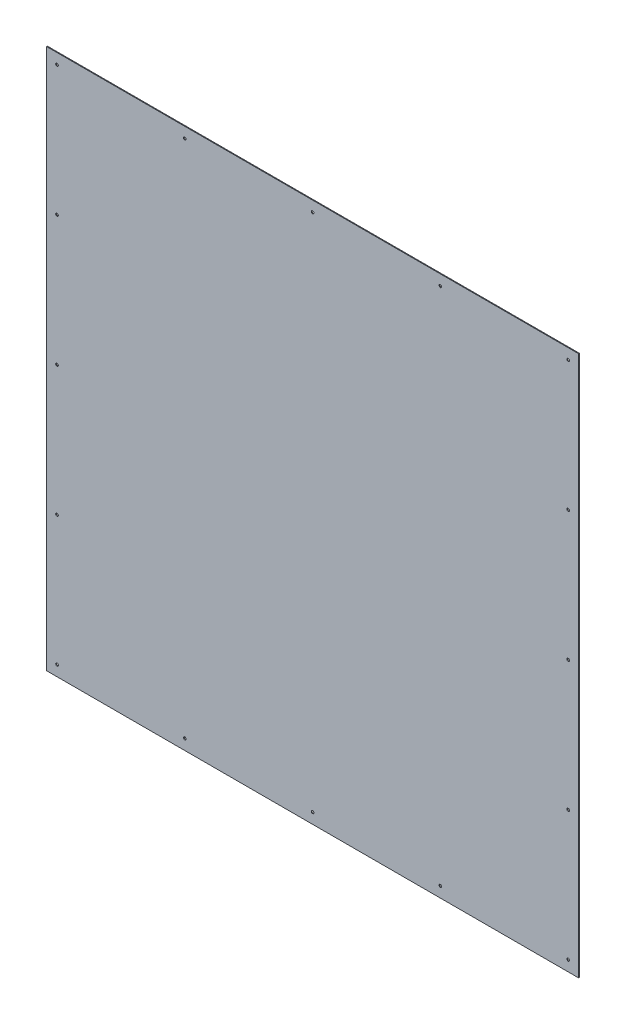
ISO-10303-21;
HEADER;
FILE_DESCRIPTION(('STEP AP214'),'2;1');
FILE_NAME('part.step','',(''),(''),'','','');
FILE_SCHEMA(('AUTOMOTIVE_DESIGN { 1 0 10303 214 1 1 1 1 }'));
ENDSEC;
DATA;
#1=APPLICATION_CONTEXT('core data for automotive mechanical design processes');
#2=APPLICATION_PROTOCOL_DEFINITION('international standard','automotive_design',2000,#1);
#3=PRODUCT_CONTEXT('',#1,'mechanical');
#4=PRODUCT('Part','Part','',(#3));
#5=PRODUCT_RELATED_PRODUCT_CATEGORY('part','',(#4));
#6=PRODUCT_DEFINITION_FORMATION('','',#4);
#7=PRODUCT_DEFINITION_CONTEXT('part definition',#1,'design');
#8=PRODUCT_DEFINITION('design','',#6,#7);
#9=PRODUCT_DEFINITION_SHAPE('','',#8);
#10=(LENGTH_UNIT() NAMED_UNIT(*) SI_UNIT(.MILLI.,.METRE.));
#11=(NAMED_UNIT(*) PLANE_ANGLE_UNIT() SI_UNIT($,.RADIAN.));
#12=(NAMED_UNIT(*) SI_UNIT($,.STERADIAN.) SOLID_ANGLE_UNIT());
#13=UNCERTAINTY_MEASURE_WITH_UNIT(LENGTH_MEASURE(1.E-05),#10,'distance_accuracy_value','');
#14=(GEOMETRIC_REPRESENTATION_CONTEXT(3) GLOBAL_UNCERTAINTY_ASSIGNED_CONTEXT((#13)) GLOBAL_UNIT_ASSIGNED_CONTEXT((#10,
#11,#12)) REPRESENTATION_CONTEXT('',''));
#15=CARTESIAN_POINT('',(0.,0.,0.));
#16=DIRECTION('',(0.,0.,1.));
#17=DIRECTION('',(1.,0.,0.));
#18=AXIS2_PLACEMENT_3D('',#15,#16,#17);
#19=CARTESIAN_POINT('',(640.,650.,1.9));
#20=DIRECTION('',(-1.,0.,0.));
#21=DIRECTION('',(0.,-1.,0.));
#22=AXIS2_PLACEMENT_3D('',#19,#20,#21);
#23=PLANE('',#22);
#24=DIRECTION('',(0.,1.,0.));
#25=VECTOR('',#24,1.);
#26=CARTESIAN_POINT('',(640.,650.,0.));
#27=LINE('',#26,#25);
#28=CARTESIAN_POINT('',(640.,-650.,0.));
#29=VERTEX_POINT('',#28);
#30=CARTESIAN_POINT('',(640.,650.,0.));
#31=VERTEX_POINT('',#30);
#32=EDGE_CURVE('E98',#29,#31,#27,.T.);
#33=ORIENTED_EDGE('',*,*,#32,.T.);
#34=DIRECTION('',(0.,0.,-1.));
#35=VECTOR('',#34,1.);
#36=CARTESIAN_POINT('',(640.,650.,1.9));
#37=LINE('',#36,#35);
#38=CARTESIAN_POINT('',(640.,650.,1.9));
#39=VERTEX_POINT('',#38);
#40=EDGE_CURVE('E11',#39,#31,#37,.T.);
#41=ORIENTED_EDGE('',*,*,#40,.F.);
#42=DIRECTION('',(0.,1.,0.));
#43=VECTOR('',#42,1.);
#44=CARTESIAN_POINT('',(640.,650.,1.9));
#45=LINE('',#44,#43);
#46=CARTESIAN_POINT('',(640.,-650.,1.9));
#47=VERTEX_POINT('',#46);
#48=EDGE_CURVE('E85',#47,#39,#45,.T.);
#49=ORIENTED_EDGE('',*,*,#48,.F.);
#50=DIRECTION('',(0.,0.,-1.));
#51=VECTOR('',#50,1.);
#52=CARTESIAN_POINT('',(640.,-650.,1.9));
#53=LINE('',#52,#51);
#54=EDGE_CURVE('E94',#47,#29,#53,.T.);
#55=ORIENTED_EDGE('',*,*,#54,.T.);
#56=EDGE_LOOP('',(#33,#41,#49,#55));
#57=FACE_BOUND('',#56,.T.);
#58=ADVANCED_FACE('F32',(#57),#23,.F.);
#59=CARTESIAN_POINT('',(-640.,650.,1.9));
#60=DIRECTION('',(0.,-1.,0.));
#61=DIRECTION('',(0.,0.,-1.));
#62=AXIS2_PLACEMENT_3D('',#59,#60,#61);
#63=PLANE('',#62);
#64=DIRECTION('',(-1.,0.,0.));
#65=VECTOR('',#64,1.);
#66=CARTESIAN_POINT('',(-640.,650.,0.));
#67=LINE('',#66,#65);
#68=CARTESIAN_POINT('',(-640.,650.,0.));
#69=VERTEX_POINT('',#68);
#70=EDGE_CURVE('E89',#31,#69,#67,.T.);
#71=ORIENTED_EDGE('',*,*,#70,.T.);
#72=DIRECTION('',(0.,0.,-1.));
#73=VECTOR('',#72,1.);
#74=CARTESIAN_POINT('',(-640.,650.,1.9));
#75=LINE('',#74,#73);
#76=CARTESIAN_POINT('',(-640.,650.,1.9));
#77=VERTEX_POINT('',#76);
#78=EDGE_CURVE('E41',#77,#69,#75,.T.);
#79=ORIENTED_EDGE('',*,*,#78,.F.);
#80=DIRECTION('',(-1.,0.,0.));
#81=VECTOR('',#80,1.);
#82=CARTESIAN_POINT('',(-640.,650.,1.9));
#83=LINE('',#82,#81);
#84=EDGE_CURVE('E80',#39,#77,#83,.T.);
#85=ORIENTED_EDGE('',*,*,#84,.F.);
#86=ORIENTED_EDGE('',*,*,#40,.T.);
#87=EDGE_LOOP('',(#71,#79,#85,#86));
#88=FACE_BOUND('',#87,.T.);
#89=ADVANCED_FACE('F88',(#88),#63,.F.);
#90=CARTESIAN_POINT('',(-640.,650.,1.9));
#91=DIRECTION('',(1.,0.,0.));
#92=DIRECTION('',(0.,1.,0.));
#93=AXIS2_PLACEMENT_3D('',#90,#91,#92);
#94=PLANE('',#93);
#95=DIRECTION('',(0.,-1.,0.));
#96=VECTOR('',#95,1.);
#97=CARTESIAN_POINT('',(-640.,650.,0.));
#98=LINE('',#97,#96);
#99=CARTESIAN_POINT('',(-640.,-650.,0.));
#100=VERTEX_POINT('',#99);
#101=EDGE_CURVE('E67',#69,#100,#98,.T.);
#102=ORIENTED_EDGE('',*,*,#101,.T.);
#103=DIRECTION('',(0.,0.,-1.));
#104=VECTOR('',#103,1.);
#105=CARTESIAN_POINT('',(-640.,-650.,1.9));
#106=LINE('',#105,#104);
#107=CARTESIAN_POINT('',(-640.,-650.,1.9));
#108=VERTEX_POINT('',#107);
#109=EDGE_CURVE('E90',#108,#100,#106,.T.);
#110=ORIENTED_EDGE('',*,*,#109,.F.);
#111=DIRECTION('',(0.,-1.,0.));
#112=VECTOR('',#111,1.);
#113=CARTESIAN_POINT('',(-640.,650.,1.9));
#114=LINE('',#113,#112);
#115=EDGE_CURVE('E83',#77,#108,#114,.T.);
#116=ORIENTED_EDGE('',*,*,#115,.F.);
#117=ORIENTED_EDGE('',*,*,#78,.T.);
#118=EDGE_LOOP('',(#102,#110,#116,#117));
#119=FACE_BOUND('',#118,.T.);
#120=ADVANCED_FACE('F92',(#119),#94,.F.);
#121=CARTESIAN_POINT('',(-640.,-650.,1.9));
#122=DIRECTION('',(0.,1.,0.));
#123=DIRECTION('',(0.,0.,1.));
#124=AXIS2_PLACEMENT_3D('',#121,#122,#123);
#125=PLANE('',#124);
#126=DIRECTION('',(1.,0.,0.));
#127=VECTOR('',#126,1.);
#128=CARTESIAN_POINT('',(-640.,-650.,0.));
#129=LINE('',#128,#127);
#130=EDGE_CURVE('E73',#100,#29,#129,.T.);
#131=ORIENTED_EDGE('',*,*,#130,.T.);
#132=ORIENTED_EDGE('',*,*,#54,.F.);
#133=DIRECTION('',(1.,0.,0.));
#134=VECTOR('',#133,1.);
#135=CARTESIAN_POINT('',(-640.,-650.,1.9));
#136=LINE('',#135,#134);
#137=EDGE_CURVE('E50',#108,#47,#136,.T.);
#138=ORIENTED_EDGE('',*,*,#137,.F.);
#139=ORIENTED_EDGE('',*,*,#109,.T.);
#140=EDGE_LOOP('',(#131,#132,#138,#139));
#141=FACE_BOUND('',#140,.T.);
#142=ADVANCED_FACE('F212',(#141),#125,.F.);
#143=CARTESIAN_POINT('',(0.,0.,1.9));
#144=DIRECTION('',(0.,0.,1.));
#145=DIRECTION('',(1.,0.,0.));
#146=AXIS2_PLACEMENT_3D('',#143,#144,#145);
#147=PLANE('',#146);
#148=CARTESIAN_POINT('',(-307.3,624.6,1.9));
#149=DIRECTION('',(0.,0.,1.));
#150=DIRECTION('',(1.,0.,0.));
#151=AXIS2_PLACEMENT_3D('',#148,#149,#150);
#152=CIRCLE('',#151,3.17499999999997);
#153=CARTESIAN_POINT('',(-304.125,624.6,1.9));
#154=VERTEX_POINT('',#153);
#155=EDGE_CURVE('E174',#154,#154,#152,.T.);
#156=ORIENTED_EDGE('',*,*,#155,.F.);
#157=EDGE_LOOP('',(#156));
#158=FACE_BOUND('',#157,.T.);
#159=CARTESIAN_POINT('',(-307.3,-624.6,1.9));
#160=DIRECTION('',(0.,0.,1.));
#161=DIRECTION('',(-1.,0.,0.));
#162=AXIS2_PLACEMENT_3D('',#159,#160,#161);
#163=CIRCLE('',#162,3.17499999999997);
#164=CARTESIAN_POINT('',(-310.475,-624.6,1.9));
#165=VERTEX_POINT('',#164);
#166=EDGE_CURVE('E189',#165,#165,#163,.T.);
#167=ORIENTED_EDGE('',*,*,#166,.F.);
#168=EDGE_LOOP('',(#167));
#169=FACE_BOUND('',#168,.T.);
#170=CARTESIAN_POINT('',(-614.6,-312.3,1.9));
#171=DIRECTION('',(0.,0.,1.));
#172=DIRECTION('',(1.,0.,0.));
#173=AXIS2_PLACEMENT_3D('',#170,#171,#172);
#174=CIRCLE('',#173,3.17500000000008);
#175=CARTESIAN_POINT('',(-611.425,-312.3,1.9));
#176=VERTEX_POINT('',#175);
#177=EDGE_CURVE('E185',#176,#176,#174,.T.);
#178=ORIENTED_EDGE('',*,*,#177,.F.);
#179=EDGE_LOOP('',(#178));
#180=FACE_BOUND('',#179,.T.);
#181=CARTESIAN_POINT('',(-614.6,0.,1.9));
#182=DIRECTION('',(0.,0.,1.));
#183=DIRECTION('',(1.,0.,0.));
#184=AXIS2_PLACEMENT_3D('',#181,#182,#183);
#185=CIRCLE('',#184,3.17500000000008);
#186=CARTESIAN_POINT('',(-611.425,0.,1.9));
#187=VERTEX_POINT('',#186);
#188=EDGE_CURVE('E182',#187,#187,#185,.T.);
#189=ORIENTED_EDGE('',*,*,#188,.F.);
#190=EDGE_LOOP('',(#189));
#191=FACE_BOUND('',#190,.T.);
#192=CARTESIAN_POINT('',(-614.6,312.3,1.9));
#193=DIRECTION('',(0.,0.,1.));
#194=DIRECTION('',(1.,0.,0.));
#195=AXIS2_PLACEMENT_3D('',#192,#193,#194);
#196=CIRCLE('',#195,3.17500000000008);
#197=CARTESIAN_POINT('',(-611.425,312.3,1.9));
#198=VERTEX_POINT('',#197);
#199=EDGE_CURVE('E186',#198,#198,#196,.T.);
#200=ORIENTED_EDGE('',*,*,#199,.F.);
#201=EDGE_LOOP('',(#200));
#202=FACE_BOUND('',#201,.T.);
#203=CARTESIAN_POINT('',(614.6,312.3,1.9));
#204=DIRECTION('',(0.,0.,1.));
#205=DIRECTION('',(-1.,0.,0.));
#206=AXIS2_PLACEMENT_3D('',#203,#204,#205);
#207=CIRCLE('',#206,3.17500000000008);
#208=CARTESIAN_POINT('',(611.425,312.3,1.9));
#209=VERTEX_POINT('',#208);
#210=EDGE_CURVE('E200',#209,#209,#207,.T.);
#211=ORIENTED_EDGE('',*,*,#210,.F.);
#212=EDGE_LOOP('',(#211));
#213=FACE_BOUND('',#212,.T.);
#214=CARTESIAN_POINT('',(614.6,0.,1.9));
#215=DIRECTION('',(0.,0.,1.));
#216=DIRECTION('',(-1.,0.,0.));
#217=AXIS2_PLACEMENT_3D('',#214,#215,#216);
#218=CIRCLE('',#217,3.17500000000008);
#219=CARTESIAN_POINT('',(611.425,0.,1.9));
#220=VERTEX_POINT('',#219);
#221=EDGE_CURVE('E197',#220,#220,#218,.T.);
#222=ORIENTED_EDGE('',*,*,#221,.F.);
#223=EDGE_LOOP('',(#222));
#224=FACE_BOUND('',#223,.T.);
#225=CARTESIAN_POINT('',(614.6,-312.3,1.9));
#226=DIRECTION('',(0.,0.,1.));
#227=DIRECTION('',(-1.,0.,0.));
#228=AXIS2_PLACEMENT_3D('',#225,#226,#227);
#229=CIRCLE('',#228,3.17500000000008);
#230=CARTESIAN_POINT('',(611.425,-312.3,1.9));
#231=VERTEX_POINT('',#230);
#232=EDGE_CURVE('E194',#231,#231,#229,.T.);
#233=ORIENTED_EDGE('',*,*,#232,.F.);
#234=EDGE_LOOP('',(#233));
#235=FACE_BOUND('',#234,.T.);
#236=CARTESIAN_POINT('',(-614.6,624.6,1.9));
#237=DIRECTION('',(0.,0.,1.));
#238=DIRECTION('',(-1.,0.,0.));
#239=AXIS2_PLACEMENT_3D('',#236,#237,#238);
#240=CIRCLE('',#239,3.17500000000011);
#241=CARTESIAN_POINT('',(-617.775,624.6,1.9));
#242=VERTEX_POINT('',#241);
#243=EDGE_CURVE('E114',#242,#242,#240,.T.);
#244=ORIENTED_EDGE('',*,*,#243,.F.);
#245=EDGE_LOOP('',(#244));
#246=FACE_BOUND('',#245,.T.);
#247=CARTESIAN_POINT('',(614.6,624.6,1.9));
#248=DIRECTION('',(0.,0.,1.));
#249=DIRECTION('',(1.,0.,0.));
#250=AXIS2_PLACEMENT_3D('',#247,#248,#249);
#251=CIRCLE('',#250,3.17500000000032);
#252=CARTESIAN_POINT('',(617.775,624.6,1.9));
#253=VERTEX_POINT('',#252);
#254=EDGE_CURVE('E164',#253,#253,#251,.T.);
#255=ORIENTED_EDGE('',*,*,#254,.F.);
#256=EDGE_LOOP('',(#255));
#257=FACE_BOUND('',#256,.T.);
#258=CARTESIAN_POINT('',(614.6,-624.6,1.9));
#259=DIRECTION('',(0.,0.,1.));
#260=DIRECTION('',(-1.,0.,0.));
#261=AXIS2_PLACEMENT_3D('',#258,#259,#260);
#262=CIRCLE('',#261,3.17500000000029);
#263=CARTESIAN_POINT('',(611.425,-624.6,1.9));
#264=VERTEX_POINT('',#263);
#265=EDGE_CURVE('E161',#264,#264,#262,.T.);
#266=ORIENTED_EDGE('',*,*,#265,.F.);
#267=EDGE_LOOP('',(#266));
#268=FACE_BOUND('',#267,.T.);
#269=CARTESIAN_POINT('',(-1.11022302462516E-13,624.6,1.9));
#270=DIRECTION('',(0.,0.,1.));
#271=DIRECTION('',(-1.,0.,0.));
#272=AXIS2_PLACEMENT_3D('',#269,#270,#271);
#273=CIRCLE('',#272,3.175);
#274=CARTESIAN_POINT('',(-3.17500000000011,624.6,1.9));
#275=VERTEX_POINT('',#274);
#276=EDGE_CURVE('E165',#275,#275,#273,.T.);
#277=ORIENTED_EDGE('',*,*,#276,.F.);
#278=EDGE_LOOP('',(#277));
#279=FACE_BOUND('',#278,.T.);
#280=CARTESIAN_POINT('',(-1.11022302462516E-13,-624.6,1.9));
#281=DIRECTION('',(0.,0.,1.));
#282=DIRECTION('',(1.,0.,0.));
#283=AXIS2_PLACEMENT_3D('',#280,#281,#282);
#284=CIRCLE('',#283,3.175);
#285=CARTESIAN_POINT('',(3.17499999999989,-624.6,1.9));
#286=VERTEX_POINT('',#285);
#287=EDGE_CURVE('E177',#286,#286,#284,.T.);
#288=ORIENTED_EDGE('',*,*,#287,.F.);
#289=EDGE_LOOP('',(#288));
#290=FACE_BOUND('',#289,.T.);
#291=CARTESIAN_POINT('',(307.3,-624.6,1.9));
#292=DIRECTION('',(0.,0.,1.));
#293=DIRECTION('',(1.,0.,0.));
#294=AXIS2_PLACEMENT_3D('',#291,#292,#293);
#295=CIRCLE('',#294,3.17499999999997);
#296=CARTESIAN_POINT('',(310.475,-624.6,1.9));
#297=VERTEX_POINT('',#296);
#298=EDGE_CURVE('E173',#297,#297,#295,.T.);
#299=ORIENTED_EDGE('',*,*,#298,.F.);
#300=EDGE_LOOP('',(#299));
#301=FACE_BOUND('',#300,.T.);
#302=CARTESIAN_POINT('',(307.3,624.6,1.9));
#303=DIRECTION('',(0.,0.,1.));
#304=DIRECTION('',(-1.,0.,0.));
#305=AXIS2_PLACEMENT_3D('',#302,#303,#304);
#306=CIRCLE('',#305,3.17499999999997);
#307=CARTESIAN_POINT('',(304.125,624.6,1.9));
#308=VERTEX_POINT('',#307);
#309=EDGE_CURVE('E170',#308,#308,#306,.T.);
#310=ORIENTED_EDGE('',*,*,#309,.F.);
#311=EDGE_LOOP('',(#310));
#312=FACE_BOUND('',#311,.T.);
#313=CARTESIAN_POINT('',(-614.6,-624.6,1.9));
#314=DIRECTION('',(0.,0.,1.));
#315=DIRECTION('',(1.,0.,0.));
#316=AXIS2_PLACEMENT_3D('',#313,#314,#315);
#317=CIRCLE('',#316,3.17500000000008);
#318=CARTESIAN_POINT('',(-611.425,-624.6,1.9));
#319=VERTEX_POINT('',#318);
#320=EDGE_CURVE('E109',#319,#319,#317,.T.);
#321=ORIENTED_EDGE('',*,*,#320,.F.);
#322=EDGE_LOOP('',(#321));
#323=FACE_BOUND('',#322,.T.);
#324=ORIENTED_EDGE('',*,*,#48,.T.);
#325=ORIENTED_EDGE('',*,*,#84,.T.);
#326=ORIENTED_EDGE('',*,*,#115,.T.);
#327=ORIENTED_EDGE('',*,*,#137,.T.);
#328=EDGE_LOOP('',(#324,#325,#326,#327));
#329=FACE_BOUND('',#328,.T.);
#330=ADVANCED_FACE('F81',(#158,#169,#180,#191,#202,#213,#224,#235,#246,#257,#268,#279,#290,#301,
#312,#323,#329),#147,.T.);
#331=CARTESIAN_POINT('',(0.,0.,0.));
#332=DIRECTION('',(0.,0.,1.));
#333=DIRECTION('',(1.,0.,0.));
#334=AXIS2_PLACEMENT_3D('',#331,#332,#333);
#335=PLANE('',#334);
#336=CARTESIAN_POINT('',(-307.3,624.6,0.));
#337=DIRECTION('',(0.,0.,1.));
#338=DIRECTION('',(1.,0.,0.));
#339=AXIS2_PLACEMENT_3D('',#336,#337,#338);
#340=CIRCLE('',#339,3.17499999999997);
#341=CARTESIAN_POINT('',(-304.125,624.6,0.));
#342=VERTEX_POINT('',#341);
#343=EDGE_CURVE('E35',#342,#342,#340,.T.);
#344=ORIENTED_EDGE('',*,*,#343,.T.);
#345=EDGE_LOOP('',(#344));
#346=FACE_BOUND('',#345,.T.);
#347=CARTESIAN_POINT('',(-307.3,-624.6,0.));
#348=DIRECTION('',(0.,0.,1.));
#349=DIRECTION('',(1.,0.,0.));
#350=AXIS2_PLACEMENT_3D('',#347,#348,#349);
#351=CIRCLE('',#350,3.17499999999997);
#352=CARTESIAN_POINT('',(-304.125,-624.6,0.));
#353=VERTEX_POINT('',#352);
#354=EDGE_CURVE('E149',#353,#353,#351,.T.);
#355=ORIENTED_EDGE('',*,*,#354,.T.);
#356=EDGE_LOOP('',(#355));
#357=FACE_BOUND('',#356,.T.);
#358=CARTESIAN_POINT('',(-614.6,-312.3,0.));
#359=DIRECTION('',(0.,0.,1.));
#360=DIRECTION('',(1.,0.,0.));
#361=AXIS2_PLACEMENT_3D('',#358,#359,#360);
#362=CIRCLE('',#361,3.17500000000008);
#363=CARTESIAN_POINT('',(-611.425,-312.3,0.));
#364=VERTEX_POINT('',#363);
#365=EDGE_CURVE('E147',#364,#364,#362,.T.);
#366=ORIENTED_EDGE('',*,*,#365,.T.);
#367=EDGE_LOOP('',(#366));
#368=FACE_BOUND('',#367,.T.);
#369=CARTESIAN_POINT('',(-614.6,0.,0.));
#370=DIRECTION('',(0.,0.,1.));
#371=DIRECTION('',(1.,0.,0.));
#372=AXIS2_PLACEMENT_3D('',#369,#370,#371);
#373=CIRCLE('',#372,3.17500000000008);
#374=CARTESIAN_POINT('',(-611.425,0.,0.));
#375=VERTEX_POINT('',#374);
#376=EDGE_CURVE('E144',#375,#375,#373,.T.);
#377=ORIENTED_EDGE('',*,*,#376,.T.);
#378=EDGE_LOOP('',(#377));
#379=FACE_BOUND('',#378,.T.);
#380=CARTESIAN_POINT('',(-614.6,312.3,0.));
#381=DIRECTION('',(0.,0.,1.));
#382=DIRECTION('',(1.,0.,0.));
#383=AXIS2_PLACEMENT_3D('',#380,#381,#382);
#384=CIRCLE('',#383,3.17500000000008);
#385=CARTESIAN_POINT('',(-611.425,312.3,0.));
#386=VERTEX_POINT('',#385);
#387=EDGE_CURVE('E141',#386,#386,#384,.T.);
#388=ORIENTED_EDGE('',*,*,#387,.T.);
#389=EDGE_LOOP('',(#388));
#390=FACE_BOUND('',#389,.T.);
#391=CARTESIAN_POINT('',(614.6,312.3,0.));
#392=DIRECTION('',(0.,0.,1.));
#393=DIRECTION('',(1.,0.,0.));
#394=AXIS2_PLACEMENT_3D('',#391,#392,#393);
#395=CIRCLE('',#394,3.17500000000008);
#396=CARTESIAN_POINT('',(617.775,312.3,0.));
#397=VERTEX_POINT('',#396);
#398=EDGE_CURVE('E138',#397,#397,#395,.T.);
#399=ORIENTED_EDGE('',*,*,#398,.T.);
#400=EDGE_LOOP('',(#399));
#401=FACE_BOUND('',#400,.T.);
#402=CARTESIAN_POINT('',(614.6,0.,0.));
#403=DIRECTION('',(0.,0.,1.));
#404=DIRECTION('',(1.,0.,0.));
#405=AXIS2_PLACEMENT_3D('',#402,#403,#404);
#406=CIRCLE('',#405,3.17500000000008);
#407=CARTESIAN_POINT('',(617.775,0.,0.));
#408=VERTEX_POINT('',#407);
#409=EDGE_CURVE('E135',#408,#408,#406,.T.);
#410=ORIENTED_EDGE('',*,*,#409,.T.);
#411=EDGE_LOOP('',(#410));
#412=FACE_BOUND('',#411,.T.);
#413=CARTESIAN_POINT('',(614.6,-312.3,0.));
#414=DIRECTION('',(0.,0.,1.));
#415=DIRECTION('',(1.,0.,0.));
#416=AXIS2_PLACEMENT_3D('',#413,#414,#415);
#417=CIRCLE('',#416,3.17500000000008);
#418=CARTESIAN_POINT('',(617.775,-312.3,0.));
#419=VERTEX_POINT('',#418);
#420=EDGE_CURVE('E132',#419,#419,#417,.T.);
#421=ORIENTED_EDGE('',*,*,#420,.T.);
#422=EDGE_LOOP('',(#421));
#423=FACE_BOUND('',#422,.T.);
#424=CARTESIAN_POINT('',(-614.6,624.6,0.));
#425=DIRECTION('',(0.,0.,1.));
#426=DIRECTION('',(1.,0.,0.));
#427=AXIS2_PLACEMENT_3D('',#424,#425,#426);
#428=CIRCLE('',#427,3.17500000000011);
#429=CARTESIAN_POINT('',(-611.425,624.6,0.));
#430=VERTEX_POINT('',#429);
#431=EDGE_CURVE('E129',#430,#430,#428,.T.);
#432=ORIENTED_EDGE('',*,*,#431,.T.);
#433=EDGE_LOOP('',(#432));
#434=FACE_BOUND('',#433,.T.);
#435=CARTESIAN_POINT('',(614.6,624.6,0.));
#436=DIRECTION('',(0.,0.,1.));
#437=DIRECTION('',(1.,0.,0.));
#438=AXIS2_PLACEMENT_3D('',#435,#436,#437);
#439=CIRCLE('',#438,3.17500000000032);
#440=CARTESIAN_POINT('',(617.775,624.6,0.));
#441=VERTEX_POINT('',#440);
#442=EDGE_CURVE('E126',#441,#441,#439,.T.);
#443=ORIENTED_EDGE('',*,*,#442,.T.);
#444=EDGE_LOOP('',(#443));
#445=FACE_BOUND('',#444,.T.);
#446=CARTESIAN_POINT('',(614.6,-624.6,0.));
#447=DIRECTION('',(0.,0.,1.));
#448=DIRECTION('',(1.,0.,0.));
#449=AXIS2_PLACEMENT_3D('',#446,#447,#448);
#450=CIRCLE('',#449,3.17500000000029);
#451=CARTESIAN_POINT('',(617.775,-624.6,0.));
#452=VERTEX_POINT('',#451);
#453=EDGE_CURVE('E123',#452,#452,#450,.T.);
#454=ORIENTED_EDGE('',*,*,#453,.T.);
#455=EDGE_LOOP('',(#454));
#456=FACE_BOUND('',#455,.T.);
#457=CARTESIAN_POINT('',(-1.11022302462516E-13,624.6,0.));
#458=DIRECTION('',(0.,0.,1.));
#459=DIRECTION('',(1.,0.,0.));
#460=AXIS2_PLACEMENT_3D('',#457,#458,#459);
#461=CIRCLE('',#460,3.175);
#462=CARTESIAN_POINT('',(3.17499999999989,624.6,0.));
#463=VERTEX_POINT('',#462);
#464=EDGE_CURVE('E120',#463,#463,#461,.T.);
#465=ORIENTED_EDGE('',*,*,#464,.T.);
#466=EDGE_LOOP('',(#465));
#467=FACE_BOUND('',#466,.T.);
#468=CARTESIAN_POINT('',(-1.11022302462516E-13,-624.6,0.));
#469=DIRECTION('',(0.,0.,1.));
#470=DIRECTION('',(1.,0.,0.));
#471=AXIS2_PLACEMENT_3D('',#468,#469,#470);
#472=CIRCLE('',#471,3.175);
#473=CARTESIAN_POINT('',(3.17499999999989,-624.6,0.));
#474=VERTEX_POINT('',#473);
#475=EDGE_CURVE('E117',#474,#474,#472,.T.);
#476=ORIENTED_EDGE('',*,*,#475,.T.);
#477=EDGE_LOOP('',(#476));
#478=FACE_BOUND('',#477,.T.);
#479=CARTESIAN_POINT('',(307.3,-624.6,0.));
#480=DIRECTION('',(0.,0.,1.));
#481=DIRECTION('',(1.,0.,0.));
#482=AXIS2_PLACEMENT_3D('',#479,#480,#481);
#483=CIRCLE('',#482,3.17499999999997);
#484=CARTESIAN_POINT('',(310.475,-624.6,0.));
#485=VERTEX_POINT('',#484);
#486=EDGE_CURVE('E113',#485,#485,#483,.T.);
#487=ORIENTED_EDGE('',*,*,#486,.T.);
#488=EDGE_LOOP('',(#487));
#489=FACE_BOUND('',#488,.T.);
#490=CARTESIAN_POINT('',(307.3,624.6,0.));
#491=DIRECTION('',(0.,0.,1.));
#492=DIRECTION('',(1.,0.,0.));
#493=AXIS2_PLACEMENT_3D('',#490,#491,#492);
#494=CIRCLE('',#493,3.17499999999997);
#495=CARTESIAN_POINT('',(310.475,624.6,0.));
#496=VERTEX_POINT('',#495);
#497=EDGE_CURVE('E110',#496,#496,#494,.T.);
#498=ORIENTED_EDGE('',*,*,#497,.T.);
#499=EDGE_LOOP('',(#498));
#500=FACE_BOUND('',#499,.T.);
#501=CARTESIAN_POINT('',(-614.6,-624.6,0.));
#502=DIRECTION('',(0.,0.,1.));
#503=DIRECTION('',(1.,0.,0.));
#504=AXIS2_PLACEMENT_3D('',#501,#502,#503);
#505=CIRCLE('',#504,3.17500000000008);
#506=CARTESIAN_POINT('',(-611.425,-624.6,0.));
#507=VERTEX_POINT('',#506);
#508=EDGE_CURVE('E101',#507,#507,#505,.T.);
#509=ORIENTED_EDGE('',*,*,#508,.T.);
#510=EDGE_LOOP('',(#509));
#511=FACE_BOUND('',#510,.T.);
#512=ORIENTED_EDGE('',*,*,#32,.F.);
#513=ORIENTED_EDGE('',*,*,#130,.F.);
#514=ORIENTED_EDGE('',*,*,#101,.F.);
#515=ORIENTED_EDGE('',*,*,#70,.F.);
#516=EDGE_LOOP('',(#512,#513,#514,#515));
#517=FACE_BOUND('',#516,.T.);
#518=ADVANCED_FACE('F211',(#346,#357,#368,#379,#390,#401,#412,#423,#434,#445,#456,#467,#478,
#489,#500,#511,#517),#335,.F.);
#519=CARTESIAN_POINT('',(-614.6,-624.6,-118.1));
#520=DIRECTION('',(0.,0.,1.));
#521=DIRECTION('',(1.,0.,0.));
#522=AXIS2_PLACEMENT_3D('',#519,#520,#521);
#523=CYLINDRICAL_SURFACE('',#522,3.17500000000008);
#524=ORIENTED_EDGE('',*,*,#320,.T.);
#525=EDGE_LOOP('',(#524));
#526=FACE_BOUND('',#525,.T.);
#527=ORIENTED_EDGE('',*,*,#508,.F.);
#528=EDGE_LOOP('',(#527));
#529=FACE_BOUND('',#528,.T.);
#530=ADVANCED_FACE('F240',(#526,#529),#523,.F.);
#531=CARTESIAN_POINT('',(307.3,624.6,-118.1));
#532=DIRECTION('',(0.,0.,1.));
#533=DIRECTION('',(1.,0.,0.));
#534=AXIS2_PLACEMENT_3D('',#531,#532,#533);
#535=CYLINDRICAL_SURFACE('',#534,3.17499999999997);
#536=ORIENTED_EDGE('',*,*,#309,.T.);
#537=EDGE_LOOP('',(#536));
#538=FACE_BOUND('',#537,.T.);
#539=ORIENTED_EDGE('',*,*,#497,.F.);
#540=EDGE_LOOP('',(#539));
#541=FACE_BOUND('',#540,.T.);
#542=ADVANCED_FACE('F236',(#538,#541),#535,.F.);
#543=CARTESIAN_POINT('',(307.3,-624.6,-118.1));
#544=DIRECTION('',(0.,0.,1.));
#545=DIRECTION('',(1.,0.,0.));
#546=AXIS2_PLACEMENT_3D('',#543,#544,#545);
#547=CYLINDRICAL_SURFACE('',#546,3.17499999999997);
#548=ORIENTED_EDGE('',*,*,#298,.T.);
#549=EDGE_LOOP('',(#548));
#550=FACE_BOUND('',#549,.T.);
#551=ORIENTED_EDGE('',*,*,#486,.F.);
#552=EDGE_LOOP('',(#551));
#553=FACE_BOUND('',#552,.T.);
#554=ADVANCED_FACE('F239',(#550,#553),#547,.F.);
#555=CARTESIAN_POINT('',(-1.11022302462516E-13,-624.6,-118.1));
#556=DIRECTION('',(0.,0.,1.));
#557=DIRECTION('',(1.,0.,0.));
#558=AXIS2_PLACEMENT_3D('',#555,#556,#557);
#559=CYLINDRICAL_SURFACE('',#558,3.175);
#560=ORIENTED_EDGE('',*,*,#287,.T.);
#561=EDGE_LOOP('',(#560));
#562=FACE_BOUND('',#561,.T.);
#563=ORIENTED_EDGE('',*,*,#475,.F.);
#564=EDGE_LOOP('',(#563));
#565=FACE_BOUND('',#564,.T.);
#566=ADVANCED_FACE('F306',(#562,#565),#559,.F.);
#567=CARTESIAN_POINT('',(-1.11022302462516E-13,624.6,-118.1));
#568=DIRECTION('',(0.,0.,1.));
#569=DIRECTION('',(1.,0.,0.));
#570=AXIS2_PLACEMENT_3D('',#567,#568,#569);
#571=CYLINDRICAL_SURFACE('',#570,3.175);
#572=ORIENTED_EDGE('',*,*,#276,.T.);
#573=EDGE_LOOP('',(#572));
#574=FACE_BOUND('',#573,.T.);
#575=ORIENTED_EDGE('',*,*,#464,.F.);
#576=EDGE_LOOP('',(#575));
#577=FACE_BOUND('',#576,.T.);
#578=ADVANCED_FACE('F316',(#574,#577),#571,.F.);
#579=CARTESIAN_POINT('',(614.6,-624.6,-118.1));
#580=DIRECTION('',(0.,0.,1.));
#581=DIRECTION('',(1.,0.,0.));
#582=AXIS2_PLACEMENT_3D('',#579,#580,#581);
#583=CYLINDRICAL_SURFACE('',#582,3.17500000000029);
#584=ORIENTED_EDGE('',*,*,#265,.T.);
#585=EDGE_LOOP('',(#584));
#586=FACE_BOUND('',#585,.T.);
#587=ORIENTED_EDGE('',*,*,#453,.F.);
#588=EDGE_LOOP('',(#587));
#589=FACE_BOUND('',#588,.T.);
#590=ADVANCED_FACE('F326',(#586,#589),#583,.F.);
#591=CARTESIAN_POINT('',(614.6,624.6,-118.1));
#592=DIRECTION('',(0.,0.,1.));
#593=DIRECTION('',(1.,0.,0.));
#594=AXIS2_PLACEMENT_3D('',#591,#592,#593);
#595=CYLINDRICAL_SURFACE('',#594,3.17500000000032);
#596=ORIENTED_EDGE('',*,*,#254,.T.);
#597=EDGE_LOOP('',(#596));
#598=FACE_BOUND('',#597,.T.);
#599=ORIENTED_EDGE('',*,*,#442,.F.);
#600=EDGE_LOOP('',(#599));
#601=FACE_BOUND('',#600,.T.);
#602=ADVANCED_FACE('F336',(#598,#601),#595,.F.);
#603=CARTESIAN_POINT('',(-614.6,624.6,-118.1));
#604=DIRECTION('',(0.,0.,1.));
#605=DIRECTION('',(1.,0.,0.));
#606=AXIS2_PLACEMENT_3D('',#603,#604,#605);
#607=CYLINDRICAL_SURFACE('',#606,3.17500000000011);
#608=ORIENTED_EDGE('',*,*,#243,.T.);
#609=EDGE_LOOP('',(#608));
#610=FACE_BOUND('',#609,.T.);
#611=ORIENTED_EDGE('',*,*,#431,.F.);
#612=EDGE_LOOP('',(#611));
#613=FACE_BOUND('',#612,.T.);
#614=ADVANCED_FACE('F346',(#610,#613),#607,.F.);
#615=CARTESIAN_POINT('',(614.6,-312.3,-118.1));
#616=DIRECTION('',(0.,0.,1.));
#617=DIRECTION('',(1.,0.,0.));
#618=AXIS2_PLACEMENT_3D('',#615,#616,#617);
#619=CYLINDRICAL_SURFACE('',#618,3.17500000000008);
#620=ORIENTED_EDGE('',*,*,#232,.T.);
#621=EDGE_LOOP('',(#620));
#622=FACE_BOUND('',#621,.T.);
#623=ORIENTED_EDGE('',*,*,#420,.F.);
#624=EDGE_LOOP('',(#623));
#625=FACE_BOUND('',#624,.T.);
#626=ADVANCED_FACE('F356',(#622,#625),#619,.F.);
#627=CARTESIAN_POINT('',(614.6,0.,-118.1));
#628=DIRECTION('',(0.,0.,1.));
#629=DIRECTION('',(1.,0.,0.));
#630=AXIS2_PLACEMENT_3D('',#627,#628,#629);
#631=CYLINDRICAL_SURFACE('',#630,3.17500000000008);
#632=ORIENTED_EDGE('',*,*,#221,.T.);
#633=EDGE_LOOP('',(#632));
#634=FACE_BOUND('',#633,.T.);
#635=ORIENTED_EDGE('',*,*,#409,.F.);
#636=EDGE_LOOP('',(#635));
#637=FACE_BOUND('',#636,.T.);
#638=ADVANCED_FACE('F366',(#634,#637),#631,.F.);
#639=CARTESIAN_POINT('',(614.6,312.3,-118.1));
#640=DIRECTION('',(0.,0.,1.));
#641=DIRECTION('',(1.,0.,0.));
#642=AXIS2_PLACEMENT_3D('',#639,#640,#641);
#643=CYLINDRICAL_SURFACE('',#642,3.17500000000008);
#644=ORIENTED_EDGE('',*,*,#210,.T.);
#645=EDGE_LOOP('',(#644));
#646=FACE_BOUND('',#645,.T.);
#647=ORIENTED_EDGE('',*,*,#398,.F.);
#648=EDGE_LOOP('',(#647));
#649=FACE_BOUND('',#648,.T.);
#650=ADVANCED_FACE('F376',(#646,#649),#643,.F.);
#651=CARTESIAN_POINT('',(-614.6,312.3,-118.1));
#652=DIRECTION('',(0.,0.,1.));
#653=DIRECTION('',(1.,0.,0.));
#654=AXIS2_PLACEMENT_3D('',#651,#652,#653);
#655=CYLINDRICAL_SURFACE('',#654,3.17500000000008);
#656=ORIENTED_EDGE('',*,*,#199,.T.);
#657=EDGE_LOOP('',(#656));
#658=FACE_BOUND('',#657,.T.);
#659=ORIENTED_EDGE('',*,*,#387,.F.);
#660=EDGE_LOOP('',(#659));
#661=FACE_BOUND('',#660,.T.);
#662=ADVANCED_FACE('F206',(#658,#661),#655,.F.);
#663=CARTESIAN_POINT('',(-614.6,0.,-118.1));
#664=DIRECTION('',(0.,0.,1.));
#665=DIRECTION('',(1.,0.,0.));
#666=AXIS2_PLACEMENT_3D('',#663,#664,#665);
#667=CYLINDRICAL_SURFACE('',#666,3.17500000000008);
#668=ORIENTED_EDGE('',*,*,#188,.T.);
#669=EDGE_LOOP('',(#668));
#670=FACE_BOUND('',#669,.T.);
#671=ORIENTED_EDGE('',*,*,#376,.F.);
#672=EDGE_LOOP('',(#671));
#673=FACE_BOUND('',#672,.T.);
#674=ADVANCED_FACE('F395',(#670,#673),#667,.F.);
#675=CARTESIAN_POINT('',(-614.6,-312.3,-118.1));
#676=DIRECTION('',(0.,0.,1.));
#677=DIRECTION('',(1.,0.,0.));
#678=AXIS2_PLACEMENT_3D('',#675,#676,#677);
#679=CYLINDRICAL_SURFACE('',#678,3.17500000000008);
#680=ORIENTED_EDGE('',*,*,#177,.T.);
#681=EDGE_LOOP('',(#680));
#682=FACE_BOUND('',#681,.T.);
#683=ORIENTED_EDGE('',*,*,#365,.F.);
#684=EDGE_LOOP('',(#683));
#685=FACE_BOUND('',#684,.T.);
#686=ADVANCED_FACE('F404',(#682,#685),#679,.F.);
#687=CARTESIAN_POINT('',(-307.3,-624.6,-118.1));
#688=DIRECTION('',(0.,0.,1.));
#689=DIRECTION('',(1.,0.,0.));
#690=AXIS2_PLACEMENT_3D('',#687,#688,#689);
#691=CYLINDRICAL_SURFACE('',#690,3.17499999999997);
#692=ORIENTED_EDGE('',*,*,#166,.T.);
#693=EDGE_LOOP('',(#692));
#694=FACE_BOUND('',#693,.T.);
#695=ORIENTED_EDGE('',*,*,#354,.F.);
#696=EDGE_LOOP('',(#695));
#697=FACE_BOUND('',#696,.T.);
#698=ADVANCED_FACE('F414',(#694,#697),#691,.F.);
#699=CARTESIAN_POINT('',(-307.3,624.6,-118.1));
#700=DIRECTION('',(0.,0.,1.));
#701=DIRECTION('',(1.,0.,0.));
#702=AXIS2_PLACEMENT_3D('',#699,#700,#701);
#703=CYLINDRICAL_SURFACE('',#702,3.17499999999997);
#704=ORIENTED_EDGE('',*,*,#155,.T.);
#705=EDGE_LOOP('',(#704));
#706=FACE_BOUND('',#705,.T.);
#707=ORIENTED_EDGE('',*,*,#343,.F.);
#708=EDGE_LOOP('',(#707));
#709=FACE_BOUND('',#708,.T.);
#710=ADVANCED_FACE('F424',(#706,#709),#703,.F.);
#711=CLOSED_SHELL('',(#58,#89,#120,#142,#330,#518,#530,#542,#554,#566,#578,#590,#602,#614,#626,
#638,#650,#662,#674,#686,#698,#710));
#712=MANIFOLD_SOLID_BREP('B2',#711);
#713=ADVANCED_BREP_SHAPE_REPRESENTATION('',(#18,#712),#14);
#714=SHAPE_DEFINITION_REPRESENTATION(#9,#713);
ENDSEC;
END-ISO-10303-21;
